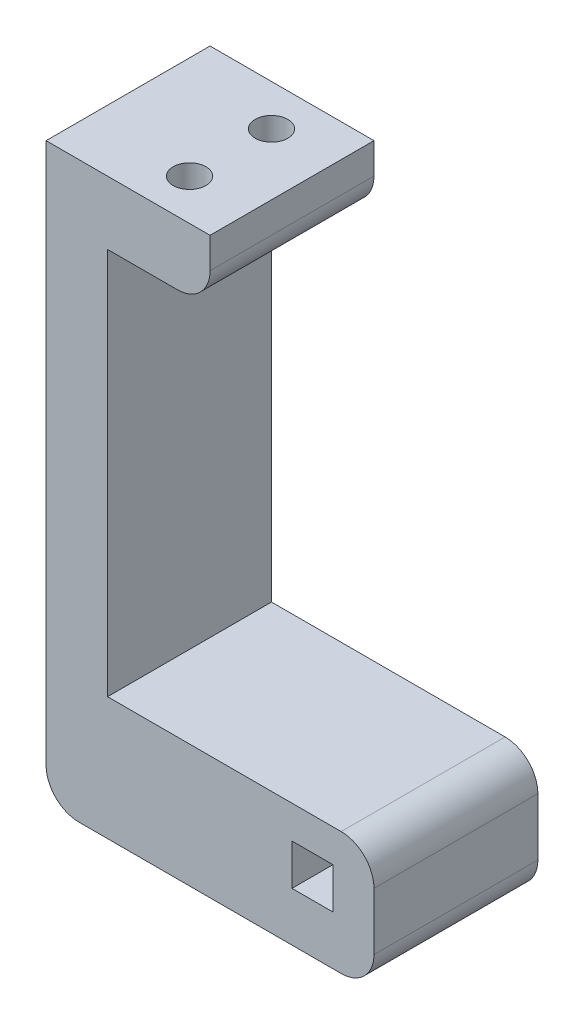
ISO-10303-21;
HEADER;
FILE_DESCRIPTION(('STEP AP214'),'2;1');
FILE_NAME('part.step','',(''),(''),'','','');
FILE_SCHEMA(('AUTOMOTIVE_DESIGN { 1 0 10303 214 1 1 1 1 }'));
ENDSEC;
DATA;
#1=APPLICATION_CONTEXT('core data for automotive mechanical design processes');
#2=APPLICATION_PROTOCOL_DEFINITION('international standard','automotive_design',2000,#1);
#3=PRODUCT_CONTEXT('',#1,'mechanical');
#4=PRODUCT('Part','Part','',(#3));
#5=PRODUCT_RELATED_PRODUCT_CATEGORY('part','',(#4));
#6=PRODUCT_DEFINITION_FORMATION('','',#4);
#7=PRODUCT_DEFINITION_CONTEXT('part definition',#1,'design');
#8=PRODUCT_DEFINITION('design','',#6,#7);
#9=PRODUCT_DEFINITION_SHAPE('','',#8);
#10=(LENGTH_UNIT() NAMED_UNIT(*) SI_UNIT(.MILLI.,.METRE.));
#11=(NAMED_UNIT(*) PLANE_ANGLE_UNIT() SI_UNIT($,.RADIAN.));
#12=(NAMED_UNIT(*) SI_UNIT($,.STERADIAN.) SOLID_ANGLE_UNIT());
#13=UNCERTAINTY_MEASURE_WITH_UNIT(LENGTH_MEASURE(1.E-05),#10,'distance_accuracy_value','');
#14=(GEOMETRIC_REPRESENTATION_CONTEXT(3) GLOBAL_UNCERTAINTY_ASSIGNED_CONTEXT((#13)) GLOBAL_UNIT_ASSIGNED_CONTEXT((#10,
#11,#12)) REPRESENTATION_CONTEXT('',''));
#15=CARTESIAN_POINT('',(0.,0.,0.));
#16=DIRECTION('',(0.,0.,1.));
#17=DIRECTION('',(1.,0.,0.));
#18=AXIS2_PLACEMENT_3D('',#15,#16,#17);
#19=CARTESIAN_POINT('',(50.8,177.8,25.4));
#20=DIRECTION('',(0.,-1.,0.));
#21=DIRECTION('',(0.,0.,-1.));
#22=AXIS2_PLACEMENT_3D('',#19,#20,#21);
#23=PLANE('',#22);
#24=CARTESIAN_POINT('',(31.75,177.8,12.7));
#25=DIRECTION('',(0.,-1.,0.));
#26=DIRECTION('',(0.,0.,-1.));
#27=AXIS2_PLACEMENT_3D('',#24,#25,#26);
#28=CIRCLE('',#27,5.07233054325736);
#29=CARTESIAN_POINT('',(31.75,177.8,7.62766945674264));
#30=VERTEX_POINT('',#29);
#31=EDGE_CURVE('E169',#30,#30,#28,.T.);
#32=ORIENTED_EDGE('',*,*,#31,.T.);
#33=EDGE_LOOP('',(#32));
#34=FACE_BOUND('',#33,.T.);
#35=CARTESIAN_POINT('',(31.75,177.8,-12.7));
#36=DIRECTION('',(0.,-1.,0.));
#37=DIRECTION('',(0.,0.,-1.));
#38=AXIS2_PLACEMENT_3D('',#35,#36,#37);
#39=CIRCLE('',#38,5.07233054325736);
#40=CARTESIAN_POINT('',(31.75,177.8,-17.7723305432574));
#41=VERTEX_POINT('',#40);
#42=EDGE_CURVE('E341',#41,#41,#39,.T.);
#43=ORIENTED_EDGE('',*,*,#42,.T.);
#44=EDGE_LOOP('',(#43));
#45=FACE_BOUND('',#44,.T.);
#46=DIRECTION('',(-1.,0.,0.));
#47=VECTOR('',#46,1.);
#48=CARTESIAN_POINT('',(50.8,177.8,-25.4));
#49=LINE('',#48,#47);
#50=CARTESIAN_POINT('',(50.8,177.8,-25.4));
#51=VERTEX_POINT('',#50);
#52=CARTESIAN_POINT('',(0.,177.8,-25.4));
#53=VERTEX_POINT('',#52);
#54=EDGE_CURVE('E181',#51,#53,#49,.T.);
#55=ORIENTED_EDGE('',*,*,#54,.T.);
#56=DIRECTION('',(0.,0.,-1.));
#57=VECTOR('',#56,1.);
#58=CARTESIAN_POINT('',(0.,177.8,25.4));
#59=LINE('',#58,#57);
#60=CARTESIAN_POINT('',(0.,177.8,25.4));
#61=VERTEX_POINT('',#60);
#62=EDGE_CURVE('E11',#61,#53,#59,.T.);
#63=ORIENTED_EDGE('',*,*,#62,.F.);
#64=DIRECTION('',(-1.,0.,0.));
#65=VECTOR('',#64,1.);
#66=CARTESIAN_POINT('',(50.8,177.8,25.4));
#67=LINE('',#66,#65);
#68=CARTESIAN_POINT('',(50.8,177.8,25.4));
#69=VERTEX_POINT('',#68);
#70=EDGE_CURVE('E185',#69,#61,#67,.T.);
#71=ORIENTED_EDGE('',*,*,#70,.F.);
#72=DIRECTION('',(0.,0.,-1.));
#73=VECTOR('',#72,1.);
#74=CARTESIAN_POINT('',(50.8,177.8,25.4));
#75=LINE('',#74,#73);
#76=EDGE_CURVE('E211',#69,#51,#75,.T.);
#77=ORIENTED_EDGE('',*,*,#76,.T.);
#78=EDGE_LOOP('',(#55,#63,#71,#77));
#79=FACE_BOUND('',#78,.T.);
#80=ADVANCED_FACE('F33',(#34,#45,#79),#23,.F.);
#81=CARTESIAN_POINT('',(0.,177.8,25.4));
#82=DIRECTION('',(1.,0.,0.));
#83=DIRECTION('',(0.,1.,0.));
#84=AXIS2_PLACEMENT_3D('',#81,#82,#83);
#85=PLANE('',#84);
#86=DIRECTION('',(0.,-1.,0.));
#87=VECTOR('',#86,1.);
#88=CARTESIAN_POINT('',(0.,177.8,-25.4));
#89=LINE('',#88,#87);
#90=CARTESIAN_POINT('',(0.,10.16,-25.4));
#91=VERTEX_POINT('',#90);
#92=EDGE_CURVE('E214',#53,#91,#89,.T.);
#93=ORIENTED_EDGE('',*,*,#92,.T.);
#94=DIRECTION('',(0.,0.,-1.));
#95=VECTOR('',#94,1.);
#96=CARTESIAN_POINT('',(0.,10.16,25.4));
#97=LINE('',#96,#95);
#98=CARTESIAN_POINT('',(0.,10.16,25.4));
#99=VERTEX_POINT('',#98);
#100=EDGE_CURVE('E40',#99,#91,#97,.T.);
#101=ORIENTED_EDGE('',*,*,#100,.F.);
#102=DIRECTION('',(0.,-1.,0.));
#103=VECTOR('',#102,1.);
#104=CARTESIAN_POINT('',(0.,177.8,25.4));
#105=LINE('',#104,#103);
#106=EDGE_CURVE('E188',#61,#99,#105,.T.);
#107=ORIENTED_EDGE('',*,*,#106,.F.);
#108=ORIENTED_EDGE('',*,*,#62,.T.);
#109=EDGE_LOOP('',(#93,#101,#107,#108));
#110=FACE_BOUND('',#109,.T.);
#111=ADVANCED_FACE('F289',(#110),#85,.F.);
#112=CARTESIAN_POINT('',(10.16,10.16,25.4));
#113=DIRECTION('',(0.,0.,-1.));
#114=DIRECTION('',(-1.,0.,0.));
#115=AXIS2_PLACEMENT_3D('',#112,#113,#114);
#116=CYLINDRICAL_SURFACE('',#115,10.16);
#117=CARTESIAN_POINT('',(10.16,10.16,-25.4));
#118=DIRECTION('',(0.,0.,1.));
#119=DIRECTION('',(-1.,0.,0.));
#120=AXIS2_PLACEMENT_3D('',#117,#118,#119);
#121=CIRCLE('',#120,10.16);
#122=CARTESIAN_POINT('',(10.1600000000001,0.,-25.4));
#123=VERTEX_POINT('',#122);
#124=EDGE_CURVE('E216',#91,#123,#121,.T.);
#125=ORIENTED_EDGE('',*,*,#124,.T.);
#126=DIRECTION('',(0.,0.,-1.));
#127=VECTOR('',#126,1.);
#128=CARTESIAN_POINT('',(10.1600000000001,0.,25.4));
#129=LINE('',#128,#127);
#130=CARTESIAN_POINT('',(10.1600000000001,0.,25.4));
#131=VERTEX_POINT('',#130);
#132=EDGE_CURVE('E261',#131,#123,#129,.T.);
#133=ORIENTED_EDGE('',*,*,#132,.F.);
#134=CARTESIAN_POINT('',(10.16,10.16,25.4));
#135=DIRECTION('',(0.,0.,1.));
#136=DIRECTION('',(-1.,0.,0.));
#137=AXIS2_PLACEMENT_3D('',#134,#135,#136);
#138=CIRCLE('',#137,10.16);
#139=EDGE_CURVE('E191',#99,#131,#138,.T.);
#140=ORIENTED_EDGE('',*,*,#139,.F.);
#141=ORIENTED_EDGE('',*,*,#100,.T.);
#142=EDGE_LOOP('',(#125,#133,#140,#141));
#143=FACE_BOUND('',#142,.T.);
#144=ADVANCED_FACE('F268',(#143),#116,.T.);
#145=CARTESIAN_POINT('',(10.1600000000001,0.,25.4));
#146=DIRECTION('',(0.,1.,0.));
#147=DIRECTION('',(0.,0.,1.));
#148=AXIS2_PLACEMENT_3D('',#145,#146,#147);
#149=PLANE('',#148);
#150=DIRECTION('',(1.,0.,0.));
#151=VECTOR('',#150,1.);
#152=CARTESIAN_POINT('',(10.1600000000001,0.,-25.4));
#153=LINE('',#152,#151);
#154=CARTESIAN_POINT('',(91.4399999999999,0.,-25.4));
#155=VERTEX_POINT('',#154);
#156=EDGE_CURVE('E218',#123,#155,#153,.T.);
#157=ORIENTED_EDGE('',*,*,#156,.T.);
#158=DIRECTION('',(0.,0.,-1.));
#159=VECTOR('',#158,1.);
#160=CARTESIAN_POINT('',(91.4399999999999,0.,25.4));
#161=LINE('',#160,#159);
#162=CARTESIAN_POINT('',(91.4399999999999,0.,25.4));
#163=VERTEX_POINT('',#162);
#164=EDGE_CURVE('E258',#163,#155,#161,.T.);
#165=ORIENTED_EDGE('',*,*,#164,.F.);
#166=DIRECTION('',(1.,0.,0.));
#167=VECTOR('',#166,1.);
#168=CARTESIAN_POINT('',(10.1600000000001,0.,25.4));
#169=LINE('',#168,#167);
#170=EDGE_CURVE('E193',#131,#163,#169,.T.);
#171=ORIENTED_EDGE('',*,*,#170,.F.);
#172=ORIENTED_EDGE('',*,*,#132,.T.);
#173=EDGE_LOOP('',(#157,#165,#171,#172));
#174=FACE_BOUND('',#173,.T.);
#175=ADVANCED_FACE('F277',(#174),#149,.F.);
#176=CARTESIAN_POINT('',(91.44,10.16,25.4));
#177=DIRECTION('',(0.,0.,-1.));
#178=DIRECTION('',(-1.,0.,0.));
#179=AXIS2_PLACEMENT_3D('',#176,#177,#178);
#180=CYLINDRICAL_SURFACE('',#179,10.16);
#181=CARTESIAN_POINT('',(91.44,10.16,-25.4));
#182=DIRECTION('',(0.,0.,1.));
#183=DIRECTION('',(1.,0.,0.));
#184=AXIS2_PLACEMENT_3D('',#181,#182,#183);
#185=CIRCLE('',#184,10.16);
#186=CARTESIAN_POINT('',(101.6,10.1600000000001,-25.4));
#187=VERTEX_POINT('',#186);
#188=EDGE_CURVE('E220',#155,#187,#185,.T.);
#189=ORIENTED_EDGE('',*,*,#188,.T.);
#190=DIRECTION('',(0.,0.,-1.));
#191=VECTOR('',#190,1.);
#192=CARTESIAN_POINT('',(101.6,10.1600000000001,25.4));
#193=LINE('',#192,#191);
#194=CARTESIAN_POINT('',(101.6,10.1600000000001,25.4));
#195=VERTEX_POINT('',#194);
#196=EDGE_CURVE('E255',#195,#187,#193,.T.);
#197=ORIENTED_EDGE('',*,*,#196,.F.);
#198=CARTESIAN_POINT('',(91.44,10.16,25.4));
#199=DIRECTION('',(0.,0.,1.));
#200=DIRECTION('',(1.,0.,0.));
#201=AXIS2_PLACEMENT_3D('',#198,#199,#200);
#202=CIRCLE('',#201,10.16);
#203=EDGE_CURVE('E195',#163,#195,#202,.T.);
#204=ORIENTED_EDGE('',*,*,#203,.F.);
#205=ORIENTED_EDGE('',*,*,#164,.T.);
#206=EDGE_LOOP('',(#189,#197,#204,#205));
#207=FACE_BOUND('',#206,.T.);
#208=ADVANCED_FACE('F281',(#207),#180,.T.);
#209=CARTESIAN_POINT('',(101.6,10.1600000000001,25.4));
#210=DIRECTION('',(-1.,0.,0.));
#211=DIRECTION('',(0.,0.,1.));
#212=AXIS2_PLACEMENT_3D('',#209,#210,#211);
#213=PLANE('',#212);
#214=DIRECTION('',(0.,1.,0.));
#215=VECTOR('',#214,1.);
#216=CARTESIAN_POINT('',(101.6,10.1600000000001,-25.4));
#217=LINE('',#216,#215);
#218=CARTESIAN_POINT('',(101.6,27.9399999999999,-25.4));
#219=VERTEX_POINT('',#218);
#220=EDGE_CURVE('E222',#187,#219,#217,.T.);
#221=ORIENTED_EDGE('',*,*,#220,.T.);
#222=DIRECTION('',(0.,0.,-1.));
#223=VECTOR('',#222,1.);
#224=CARTESIAN_POINT('',(101.6,27.9399999999999,25.4));
#225=LINE('',#224,#223);
#226=CARTESIAN_POINT('',(101.6,27.9399999999999,25.4));
#227=VERTEX_POINT('',#226);
#228=EDGE_CURVE('E252',#227,#219,#225,.T.);
#229=ORIENTED_EDGE('',*,*,#228,.F.);
#230=DIRECTION('',(0.,1.,0.));
#231=VECTOR('',#230,1.);
#232=CARTESIAN_POINT('',(101.6,10.1600000000001,25.4));
#233=LINE('',#232,#231);
#234=EDGE_CURVE('E197',#195,#227,#233,.T.);
#235=ORIENTED_EDGE('',*,*,#234,.F.);
#236=ORIENTED_EDGE('',*,*,#196,.T.);
#237=EDGE_LOOP('',(#221,#229,#235,#236));
#238=FACE_BOUND('',#237,.T.);
#239=ADVANCED_FACE('F322',(#238),#213,.F.);
#240=CARTESIAN_POINT('',(91.44,27.94,25.4));
#241=DIRECTION('',(0.,0.,-1.));
#242=DIRECTION('',(-1.,0.,0.));
#243=AXIS2_PLACEMENT_3D('',#240,#241,#242);
#244=CYLINDRICAL_SURFACE('',#243,10.16);
#245=CARTESIAN_POINT('',(91.44,27.94,-25.4));
#246=DIRECTION('',(0.,0.,1.));
#247=DIRECTION('',(1.,0.,0.));
#248=AXIS2_PLACEMENT_3D('',#245,#246,#247);
#249=CIRCLE('',#248,10.16);
#250=CARTESIAN_POINT('',(91.4399999999999,38.1,-25.4));
#251=VERTEX_POINT('',#250);
#252=EDGE_CURVE('E224',#219,#251,#249,.T.);
#253=ORIENTED_EDGE('',*,*,#252,.T.);
#254=DIRECTION('',(0.,0.,-1.));
#255=VECTOR('',#254,1.);
#256=CARTESIAN_POINT('',(91.4399999999999,38.1,25.4));
#257=LINE('',#256,#255);
#258=CARTESIAN_POINT('',(91.4399999999999,38.1,25.4));
#259=VERTEX_POINT('',#258);
#260=EDGE_CURVE('E249',#259,#251,#257,.T.);
#261=ORIENTED_EDGE('',*,*,#260,.F.);
#262=CARTESIAN_POINT('',(91.44,27.94,25.4));
#263=DIRECTION('',(0.,0.,1.));
#264=DIRECTION('',(1.,0.,0.));
#265=AXIS2_PLACEMENT_3D('',#262,#263,#264);
#266=CIRCLE('',#265,10.16);
#267=EDGE_CURVE('E199',#227,#259,#266,.T.);
#268=ORIENTED_EDGE('',*,*,#267,.F.);
#269=ORIENTED_EDGE('',*,*,#228,.T.);
#270=EDGE_LOOP('',(#253,#261,#268,#269));
#271=FACE_BOUND('',#270,.T.);
#272=ADVANCED_FACE('F320',(#271),#244,.T.);
#273=CARTESIAN_POINT('',(91.4399999999999,38.1,25.4));
#274=DIRECTION('',(0.,-1.,0.));
#275=DIRECTION('',(1.,0.,0.));
#276=AXIS2_PLACEMENT_3D('',#273,#274,#275);
#277=PLANE('',#276);
#278=DIRECTION('',(-1.,0.,0.));
#279=VECTOR('',#278,1.);
#280=CARTESIAN_POINT('',(91.4399999999999,38.1,-25.4));
#281=LINE('',#280,#279);
#282=CARTESIAN_POINT('',(19.05,38.1,-25.4));
#283=VERTEX_POINT('',#282);
#284=EDGE_CURVE('E226',#251,#283,#281,.T.);
#285=ORIENTED_EDGE('',*,*,#284,.T.);
#286=DIRECTION('',(0.,0.,-1.));
#287=VECTOR('',#286,1.);
#288=CARTESIAN_POINT('',(19.05,38.1,25.4));
#289=LINE('',#288,#287);
#290=CARTESIAN_POINT('',(19.05,38.1,25.4));
#291=VERTEX_POINT('',#290);
#292=EDGE_CURVE('E246',#291,#283,#289,.T.);
#293=ORIENTED_EDGE('',*,*,#292,.F.);
#294=DIRECTION('',(-1.,0.,0.));
#295=VECTOR('',#294,1.);
#296=CARTESIAN_POINT('',(91.4399999999999,38.1,25.4));
#297=LINE('',#296,#295);
#298=EDGE_CURVE('E201',#259,#291,#297,.T.);
#299=ORIENTED_EDGE('',*,*,#298,.F.);
#300=ORIENTED_EDGE('',*,*,#260,.T.);
#301=EDGE_LOOP('',(#285,#293,#299,#300));
#302=FACE_BOUND('',#301,.T.);
#303=ADVANCED_FACE('F316',(#302),#277,.F.);
#304=CARTESIAN_POINT('',(19.05,38.1,25.4));
#305=DIRECTION('',(-1.,0.,0.));
#306=DIRECTION('',(0.,0.,1.));
#307=AXIS2_PLACEMENT_3D('',#304,#305,#306);
#308=PLANE('',#307);
#309=DIRECTION('',(0.,1.,0.));
#310=VECTOR('',#309,1.);
#311=CARTESIAN_POINT('',(19.05,38.1,-25.4));
#312=LINE('',#311,#310);
#313=CARTESIAN_POINT('',(19.05,158.12976744186,-25.4));
#314=VERTEX_POINT('',#313);
#315=EDGE_CURVE('E228',#283,#314,#312,.T.);
#316=ORIENTED_EDGE('',*,*,#315,.T.);
#317=DIRECTION('',(0.,0.,-1.));
#318=VECTOR('',#317,1.);
#319=CARTESIAN_POINT('',(19.05,158.12976744186,25.4));
#320=LINE('',#319,#318);
#321=CARTESIAN_POINT('',(19.05,158.12976744186,25.4));
#322=VERTEX_POINT('',#321);
#323=EDGE_CURVE('E243',#322,#314,#320,.T.);
#324=ORIENTED_EDGE('',*,*,#323,.F.);
#325=DIRECTION('',(0.,1.,0.));
#326=VECTOR('',#325,1.);
#327=CARTESIAN_POINT('',(19.05,38.1,25.4));
#328=LINE('',#327,#326);
#329=EDGE_CURVE('E203',#291,#322,#328,.T.);
#330=ORIENTED_EDGE('',*,*,#329,.F.);
#331=ORIENTED_EDGE('',*,*,#292,.T.);
#332=EDGE_LOOP('',(#316,#324,#330,#331));
#333=FACE_BOUND('',#332,.T.);
#334=ADVANCED_FACE('F311',(#333),#308,.F.);
#335=CARTESIAN_POINT('',(19.05,158.12976744186,25.4));
#336=DIRECTION('',(0.,1.,0.));
#337=DIRECTION('',(0.,0.,1.));
#338=AXIS2_PLACEMENT_3D('',#335,#336,#337);
#339=PLANE('',#338);
#340=CARTESIAN_POINT('',(31.75,158.12976744186,12.7));
#341=DIRECTION('',(0.,-1.,0.));
#342=DIRECTION('',(0.,0.,-1.));
#343=AXIS2_PLACEMENT_3D('',#340,#341,#342);
#344=CIRCLE('',#343,5.07233054325736);
#345=CARTESIAN_POINT('',(31.75,158.12976744186,7.62766945674264));
#346=VERTEX_POINT('',#345);
#347=EDGE_CURVE('E343',#346,#346,#344,.T.);
#348=ORIENTED_EDGE('',*,*,#347,.F.);
#349=EDGE_LOOP('',(#348));
#350=FACE_BOUND('',#349,.T.);
#351=CARTESIAN_POINT('',(31.75,158.12976744186,-12.7));
#352=DIRECTION('',(0.,-1.,0.));
#353=DIRECTION('',(0.,0.,-1.));
#354=AXIS2_PLACEMENT_3D('',#351,#352,#353);
#355=CIRCLE('',#354,5.07233054325736);
#356=CARTESIAN_POINT('',(31.75,158.12976744186,-17.7723305432574));
#357=VERTEX_POINT('',#356);
#358=EDGE_CURVE('E345',#357,#357,#355,.T.);
#359=ORIENTED_EDGE('',*,*,#358,.F.);
#360=EDGE_LOOP('',(#359));
#361=FACE_BOUND('',#360,.T.);
#362=DIRECTION('',(1.,0.,0.));
#363=VECTOR('',#362,1.);
#364=CARTESIAN_POINT('',(19.05,158.12976744186,-25.4));
#365=LINE('',#364,#363);
#366=CARTESIAN_POINT('',(40.6399999999999,158.12976744186,-25.4));
#367=VERTEX_POINT('',#366);
#368=EDGE_CURVE('E230',#314,#367,#365,.T.);
#369=ORIENTED_EDGE('',*,*,#368,.T.);
#370=DIRECTION('',(0.,0.,-1.));
#371=VECTOR('',#370,1.);
#372=CARTESIAN_POINT('',(40.6399999999999,158.12976744186,25.4));
#373=LINE('',#372,#371);
#374=CARTESIAN_POINT('',(40.6399999999999,158.12976744186,25.4));
#375=VERTEX_POINT('',#374);
#376=EDGE_CURVE('E240',#375,#367,#373,.T.);
#377=ORIENTED_EDGE('',*,*,#376,.F.);
#378=DIRECTION('',(1.,0.,0.));
#379=VECTOR('',#378,1.);
#380=CARTESIAN_POINT('',(19.05,158.12976744186,25.4));
#381=LINE('',#380,#379);
#382=EDGE_CURVE('E205',#322,#375,#381,.T.);
#383=ORIENTED_EDGE('',*,*,#382,.F.);
#384=ORIENTED_EDGE('',*,*,#323,.T.);
#385=EDGE_LOOP('',(#369,#377,#383,#384));
#386=FACE_BOUND('',#385,.T.);
#387=ADVANCED_FACE('F305',(#350,#361,#386),#339,.F.);
#388=CARTESIAN_POINT('',(40.64,168.28976744186,25.4));
#389=DIRECTION('',(0.,0.,-1.));
#390=DIRECTION('',(-1.,0.,0.));
#391=AXIS2_PLACEMENT_3D('',#388,#389,#390);
#392=CYLINDRICAL_SURFACE('',#391,10.16);
#393=CARTESIAN_POINT('',(40.64,168.28976744186,-25.4));
#394=DIRECTION('',(0.,0.,1.));
#395=DIRECTION('',(1.,0.,0.));
#396=AXIS2_PLACEMENT_3D('',#393,#394,#395);
#397=CIRCLE('',#396,10.16);
#398=CARTESIAN_POINT('',(50.8,168.289767441861,-25.4));
#399=VERTEX_POINT('',#398);
#400=EDGE_CURVE('E232',#367,#399,#397,.T.);
#401=ORIENTED_EDGE('',*,*,#400,.T.);
#402=DIRECTION('',(0.,0.,-1.));
#403=VECTOR('',#402,1.);
#404=CARTESIAN_POINT('',(50.8,168.289767441861,25.4));
#405=LINE('',#404,#403);
#406=CARTESIAN_POINT('',(50.8,168.289767441861,25.4));
#407=VERTEX_POINT('',#406);
#408=EDGE_CURVE('E237',#407,#399,#405,.T.);
#409=ORIENTED_EDGE('',*,*,#408,.F.);
#410=CARTESIAN_POINT('',(40.64,168.28976744186,25.4));
#411=DIRECTION('',(0.,0.,1.));
#412=DIRECTION('',(1.,0.,0.));
#413=AXIS2_PLACEMENT_3D('',#410,#411,#412);
#414=CIRCLE('',#413,10.16);
#415=EDGE_CURVE('E207',#375,#407,#414,.T.);
#416=ORIENTED_EDGE('',*,*,#415,.F.);
#417=ORIENTED_EDGE('',*,*,#376,.T.);
#418=EDGE_LOOP('',(#401,#409,#416,#417));
#419=FACE_BOUND('',#418,.T.);
#420=ADVANCED_FACE('F301',(#419),#392,.T.);
#421=CARTESIAN_POINT('',(50.8,168.289767441861,25.4));
#422=DIRECTION('',(-1.,0.,0.));
#423=DIRECTION('',(0.,0.,1.));
#424=AXIS2_PLACEMENT_3D('',#421,#422,#423);
#425=PLANE('',#424);
#426=DIRECTION('',(0.,1.,0.));
#427=VECTOR('',#426,1.);
#428=CARTESIAN_POINT('',(50.8,168.289767441861,-25.4));
#429=LINE('',#428,#427);
#430=EDGE_CURVE('E189',#399,#51,#429,.T.);
#431=ORIENTED_EDGE('',*,*,#430,.T.);
#432=ORIENTED_EDGE('',*,*,#76,.F.);
#433=DIRECTION('',(0.,1.,0.));
#434=VECTOR('',#433,1.);
#435=CARTESIAN_POINT('',(50.8,168.289767441861,25.4));
#436=LINE('',#435,#434);
#437=EDGE_CURVE('E209',#407,#69,#436,.T.);
#438=ORIENTED_EDGE('',*,*,#437,.F.);
#439=ORIENTED_EDGE('',*,*,#408,.T.);
#440=EDGE_LOOP('',(#431,#432,#438,#439));
#441=FACE_BOUND('',#440,.T.);
#442=ADVANCED_FACE('F296',(#441),#425,.F.);
#443=CARTESIAN_POINT('',(10.16,10.16,25.4));
#444=DIRECTION('',(0.,0.,-1.));
#445=DIRECTION('',(-1.,0.,0.));
#446=AXIS2_PLACEMENT_3D('',#443,#444,#445);
#447=PLANE('',#446);
#448=DIRECTION('',(1.,0.,0.));
#449=VECTOR('',#448,1.);
#450=CARTESIAN_POINT('',(76.2,15.24,25.4));
#451=LINE('',#450,#449);
#452=CARTESIAN_POINT('',(76.2,15.24,25.4));
#453=VERTEX_POINT('',#452);
#454=CARTESIAN_POINT('',(88.9,15.24,25.4));
#455=VERTEX_POINT('',#454);
#456=EDGE_CURVE('E175',#453,#455,#451,.T.);
#457=ORIENTED_EDGE('',*,*,#456,.F.);
#458=DIRECTION('',(0.,-1.,0.));
#459=VECTOR('',#458,1.);
#460=CARTESIAN_POINT('',(76.2,27.94,25.4));
#461=LINE('',#460,#459);
#462=CARTESIAN_POINT('',(76.2,27.94,25.4));
#463=VERTEX_POINT('',#462);
#464=EDGE_CURVE('E47',#463,#453,#461,.T.);
#465=ORIENTED_EDGE('',*,*,#464,.F.);
#466=DIRECTION('',(-1.,0.,0.));
#467=VECTOR('',#466,1.);
#468=CARTESIAN_POINT('',(76.2,27.94,25.4));
#469=LINE('',#468,#467);
#470=CARTESIAN_POINT('',(88.9,27.94,25.4));
#471=VERTEX_POINT('',#470);
#472=EDGE_CURVE('E163',#471,#463,#469,.T.);
#473=ORIENTED_EDGE('',*,*,#472,.F.);
#474=DIRECTION('',(0.,1.,0.));
#475=VECTOR('',#474,1.);
#476=CARTESIAN_POINT('',(88.9,27.94,25.4));
#477=LINE('',#476,#475);
#478=EDGE_CURVE('E166',#455,#471,#477,.T.);
#479=ORIENTED_EDGE('',*,*,#478,.F.);
#480=EDGE_LOOP('',(#457,#465,#473,#479));
#481=FACE_BOUND('',#480,.T.);
#482=ORIENTED_EDGE('',*,*,#70,.T.);
#483=ORIENTED_EDGE('',*,*,#106,.T.);
#484=ORIENTED_EDGE('',*,*,#139,.T.);
#485=ORIENTED_EDGE('',*,*,#170,.T.);
#486=ORIENTED_EDGE('',*,*,#203,.T.);
#487=ORIENTED_EDGE('',*,*,#234,.T.);
#488=ORIENTED_EDGE('',*,*,#267,.T.);
#489=ORIENTED_EDGE('',*,*,#298,.T.);
#490=ORIENTED_EDGE('',*,*,#329,.T.);
#491=ORIENTED_EDGE('',*,*,#382,.T.);
#492=ORIENTED_EDGE('',*,*,#415,.T.);
#493=ORIENTED_EDGE('',*,*,#437,.T.);
#494=EDGE_LOOP('',(#482,#483,#484,#485,#486,#487,#488,#489,#490,#491,#492,#493));
#495=FACE_BOUND('',#494,.T.);
#496=ADVANCED_FACE('F285',(#481,#495),#447,.F.);
#497=CARTESIAN_POINT('',(10.16,10.16,-25.4));
#498=DIRECTION('',(0.,0.,-1.));
#499=DIRECTION('',(-1.,0.,0.));
#500=AXIS2_PLACEMENT_3D('',#497,#498,#499);
#501=PLANE('',#500);
#502=DIRECTION('',(0.,-1.,0.));
#503=VECTOR('',#502,1.);
#504=CARTESIAN_POINT('',(76.2,27.94,-25.4));
#505=LINE('',#504,#503);
#506=CARTESIAN_POINT('',(76.2,27.94,-25.4));
#507=VERTEX_POINT('',#506);
#508=CARTESIAN_POINT('',(76.2,15.24,-25.4));
#509=VERTEX_POINT('',#508);
#510=EDGE_CURVE('E147',#507,#509,#505,.T.);
#511=ORIENTED_EDGE('',*,*,#510,.T.);
#512=DIRECTION('',(1.,0.,0.));
#513=VECTOR('',#512,1.);
#514=CARTESIAN_POINT('',(76.2,15.24,-25.4));
#515=LINE('',#514,#513);
#516=CARTESIAN_POINT('',(88.9,15.24,-25.4));
#517=VERTEX_POINT('',#516);
#518=EDGE_CURVE('E156',#509,#517,#515,.T.);
#519=ORIENTED_EDGE('',*,*,#518,.T.);
#520=DIRECTION('',(0.,1.,0.));
#521=VECTOR('',#520,1.);
#522=CARTESIAN_POINT('',(88.9,27.94,-25.4));
#523=LINE('',#522,#521);
#524=CARTESIAN_POINT('',(88.9,27.94,-25.4));
#525=VERTEX_POINT('',#524);
#526=EDGE_CURVE('E55',#517,#525,#523,.T.);
#527=ORIENTED_EDGE('',*,*,#526,.T.);
#528=DIRECTION('',(-1.,0.,0.));
#529=VECTOR('',#528,1.);
#530=CARTESIAN_POINT('',(76.2,27.94,-25.4));
#531=LINE('',#530,#529);
#532=EDGE_CURVE('E153',#525,#507,#531,.T.);
#533=ORIENTED_EDGE('',*,*,#532,.T.);
#534=EDGE_LOOP('',(#511,#519,#527,#533));
#535=FACE_BOUND('',#534,.T.);
#536=ORIENTED_EDGE('',*,*,#54,.F.);
#537=ORIENTED_EDGE('',*,*,#430,.F.);
#538=ORIENTED_EDGE('',*,*,#400,.F.);
#539=ORIENTED_EDGE('',*,*,#368,.F.);
#540=ORIENTED_EDGE('',*,*,#315,.F.);
#541=ORIENTED_EDGE('',*,*,#284,.F.);
#542=ORIENTED_EDGE('',*,*,#252,.F.);
#543=ORIENTED_EDGE('',*,*,#220,.F.);
#544=ORIENTED_EDGE('',*,*,#188,.F.);
#545=ORIENTED_EDGE('',*,*,#156,.F.);
#546=ORIENTED_EDGE('',*,*,#124,.F.);
#547=ORIENTED_EDGE('',*,*,#92,.F.);
#548=EDGE_LOOP('',(#536,#537,#538,#539,#540,#541,#542,#543,#544,#545,#546,#547));
#549=FACE_BOUND('',#548,.T.);
#550=ADVANCED_FACE('F160',(#535,#549),#501,.T.);
#551=CARTESIAN_POINT('',(76.2,27.94,-25.4));
#552=DIRECTION('',(-1.,0.,0.));
#553=DIRECTION('',(0.,0.,1.));
#554=AXIS2_PLACEMENT_3D('',#551,#552,#553);
#555=PLANE('',#554);
#556=ORIENTED_EDGE('',*,*,#464,.T.);
#557=DIRECTION('',(0.,0.,1.));
#558=VECTOR('',#557,1.);
#559=CARTESIAN_POINT('',(76.2,15.24,-25.4));
#560=LINE('',#559,#558);
#561=EDGE_CURVE('E143',#509,#453,#560,.T.);
#562=ORIENTED_EDGE('',*,*,#561,.F.);
#563=ORIENTED_EDGE('',*,*,#510,.F.);
#564=DIRECTION('',(0.,0.,1.));
#565=VECTOR('',#564,1.);
#566=CARTESIAN_POINT('',(76.2,27.94,-25.4));
#567=LINE('',#566,#565);
#568=EDGE_CURVE('E179',#507,#463,#567,.T.);
#569=ORIENTED_EDGE('',*,*,#568,.T.);
#570=EDGE_LOOP('',(#556,#562,#563,#569));
#571=FACE_BOUND('',#570,.T.);
#572=ADVANCED_FACE('F145',(#571),#555,.F.);
#573=CARTESIAN_POINT('',(76.2,27.94,-25.4));
#574=DIRECTION('',(0.,1.,0.));
#575=DIRECTION('',(0.,0.,1.));
#576=AXIS2_PLACEMENT_3D('',#573,#574,#575);
#577=PLANE('',#576);
#578=ORIENTED_EDGE('',*,*,#472,.T.);
#579=ORIENTED_EDGE('',*,*,#568,.F.);
#580=ORIENTED_EDGE('',*,*,#532,.F.);
#581=DIRECTION('',(0.,0.,1.));
#582=VECTOR('',#581,1.);
#583=CARTESIAN_POINT('',(88.9,27.94,-25.4));
#584=LINE('',#583,#582);
#585=EDGE_CURVE('E182',#525,#471,#584,.T.);
#586=ORIENTED_EDGE('',*,*,#585,.T.);
#587=EDGE_LOOP('',(#578,#579,#580,#586));
#588=FACE_BOUND('',#587,.T.);
#589=ADVANCED_FACE('F414',(#588),#577,.F.);
#590=CARTESIAN_POINT('',(88.9,27.94,-25.4));
#591=DIRECTION('',(1.,0.,0.));
#592=DIRECTION('',(0.,0.,-1.));
#593=AXIS2_PLACEMENT_3D('',#590,#591,#592);
#594=PLANE('',#593);
#595=ORIENTED_EDGE('',*,*,#478,.T.);
#596=ORIENTED_EDGE('',*,*,#585,.F.);
#597=ORIENTED_EDGE('',*,*,#526,.F.);
#598=DIRECTION('',(0.,0.,1.));
#599=VECTOR('',#598,1.);
#600=CARTESIAN_POINT('',(88.9,15.24,-25.4));
#601=LINE('',#600,#599);
#602=EDGE_CURVE('E152',#517,#455,#601,.T.);
#603=ORIENTED_EDGE('',*,*,#602,.T.);
#604=EDGE_LOOP('',(#595,#596,#597,#603));
#605=FACE_BOUND('',#604,.T.);
#606=ADVANCED_FACE('F423',(#605),#594,.F.);
#607=CARTESIAN_POINT('',(76.2,15.24,-25.4));
#608=DIRECTION('',(0.,-1.,0.));
#609=DIRECTION('',(0.,0.,-1.));
#610=AXIS2_PLACEMENT_3D('',#607,#608,#609);
#611=PLANE('',#610);
#612=ORIENTED_EDGE('',*,*,#456,.T.);
#613=ORIENTED_EDGE('',*,*,#602,.F.);
#614=ORIENTED_EDGE('',*,*,#518,.F.);
#615=ORIENTED_EDGE('',*,*,#561,.T.);
#616=EDGE_LOOP('',(#612,#613,#614,#615));
#617=FACE_BOUND('',#616,.T.);
#618=ADVANCED_FACE('F157',(#617),#611,.F.);
#619=CARTESIAN_POINT('',(31.75,208.92976744186,-12.7));
#620=DIRECTION('',(0.,-1.,0.));
#621=DIRECTION('',(0.,0.,-1.));
#622=AXIS2_PLACEMENT_3D('',#619,#620,#621);
#623=CYLINDRICAL_SURFACE('',#622,5.07233054325736);
#624=ORIENTED_EDGE('',*,*,#358,.T.);
#625=EDGE_LOOP('',(#624));
#626=FACE_BOUND('',#625,.T.);
#627=ORIENTED_EDGE('',*,*,#42,.F.);
#628=EDGE_LOOP('',(#627));
#629=FACE_BOUND('',#628,.T.);
#630=ADVANCED_FACE('F351',(#626,#629),#623,.F.);
#631=CARTESIAN_POINT('',(31.75,208.92976744186,12.7));
#632=DIRECTION('',(0.,-1.,0.));
#633=DIRECTION('',(0.,0.,-1.));
#634=AXIS2_PLACEMENT_3D('',#631,#632,#633);
#635=CYLINDRICAL_SURFACE('',#634,5.07233054325736);
#636=ORIENTED_EDGE('',*,*,#347,.T.);
#637=EDGE_LOOP('',(#636));
#638=FACE_BOUND('',#637,.T.);
#639=ORIENTED_EDGE('',*,*,#31,.F.);
#640=EDGE_LOOP('',(#639));
#641=FACE_BOUND('',#640,.T.);
#642=ADVANCED_FACE('F457',(#638,#641),#635,.F.);
#643=CLOSED_SHELL('',(#80,#111,#144,#175,#208,#239,#272,#303,#334,#387,#420,#442,#496,#550,#572,
#589,#606,#618,#630,#642));
#644=MANIFOLD_SOLID_BREP('B2',#643);
#645=ADVANCED_BREP_SHAPE_REPRESENTATION('',(#18,#644),#14);
#646=SHAPE_DEFINITION_REPRESENTATION(#9,#645);
ENDSEC;
END-ISO-10303-21;
